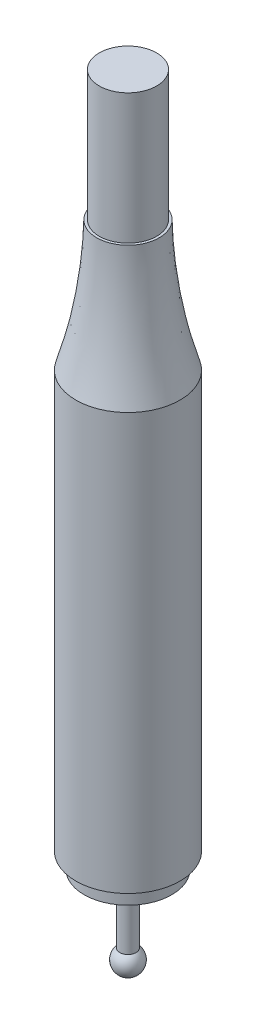
ISO-10303-21;
HEADER;
FILE_DESCRIPTION(('STEP AP214'),'2;1');
FILE_NAME('part.step','',(''),(''),'','','');
FILE_SCHEMA(('AUTOMOTIVE_DESIGN { 1 0 10303 214 1 1 1 1 }'));
ENDSEC;
DATA;
#1=APPLICATION_CONTEXT('core data for automotive mechanical design processes');
#2=APPLICATION_PROTOCOL_DEFINITION('international standard','automotive_design',2000,#1);
#3=PRODUCT_CONTEXT('',#1,'mechanical');
#4=PRODUCT('Part','Part','',(#3));
#5=PRODUCT_RELATED_PRODUCT_CATEGORY('part','',(#4));
#6=PRODUCT_DEFINITION_FORMATION('','',#4);
#7=PRODUCT_DEFINITION_CONTEXT('part definition',#1,'design');
#8=PRODUCT_DEFINITION('design','',#6,#7);
#9=PRODUCT_DEFINITION_SHAPE('','',#8);
#10=(LENGTH_UNIT() NAMED_UNIT(*) SI_UNIT(.MILLI.,.METRE.));
#11=(NAMED_UNIT(*) PLANE_ANGLE_UNIT() SI_UNIT($,.RADIAN.));
#12=(NAMED_UNIT(*) SI_UNIT($,.STERADIAN.) SOLID_ANGLE_UNIT());
#13=UNCERTAINTY_MEASURE_WITH_UNIT(LENGTH_MEASURE(1.E-05),#10,'distance_accuracy_value','');
#14=(GEOMETRIC_REPRESENTATION_CONTEXT(3) GLOBAL_UNCERTAINTY_ASSIGNED_CONTEXT((#13)) GLOBAL_UNIT_ASSIGNED_CONTEXT((#10,
#11,#12)) REPRESENTATION_CONTEXT('',''));
#15=CARTESIAN_POINT('',(0.,0.,0.));
#16=DIRECTION('',(0.,0.,1.));
#17=DIRECTION('',(1.,0.,0.));
#18=AXIS2_PLACEMENT_3D('',#15,#16,#17);
#19=CARTESIAN_POINT('',(0.,165.1,0.));
#20=DIRECTION('',(0.,1.,0.));
#21=DIRECTION('',(0.,0.,1.));
#22=AXIS2_PLACEMENT_3D('',#19,#20,#21);
#23=CYLINDRICAL_SURFACE('',#22,12.7);
#24=CARTESIAN_POINT('',(0.,101.6,0.));
#25=DIRECTION('',(0.,1.,0.));
#26=DIRECTION('',(0.,0.,1.));
#27=AXIS2_PLACEMENT_3D('',#24,#25,#26);
#28=CIRCLE('',#27,12.7);
#29=CARTESIAN_POINT('',(0.,101.6,12.7));
#30=VERTEX_POINT('',#29);
#31=EDGE_CURVE('E10',#30,#30,#28,.T.);
#32=ORIENTED_EDGE('',*,*,#31,.F.);
#33=EDGE_LOOP('',(#32));
#34=FACE_BOUND('',#33,.T.);
#35=CARTESIAN_POINT('',(0.,0.,0.));
#36=DIRECTION('',(0.,1.,0.));
#37=DIRECTION('',(0.,0.,1.));
#38=AXIS2_PLACEMENT_3D('',#35,#36,#37);
#39=CIRCLE('',#38,12.7);
#40=CARTESIAN_POINT('',(0.,0.,12.7));
#41=VERTEX_POINT('',#40);
#42=EDGE_CURVE('E62',#41,#41,#39,.T.);
#43=ORIENTED_EDGE('',*,*,#42,.T.);
#44=EDGE_LOOP('',(#43));
#45=FACE_BOUND('',#44,.T.);
#46=ADVANCED_FACE('F31',(#34,#45),#23,.T.);
#47=CARTESIAN_POINT('',(12.7,101.6,0.));
#48=CARTESIAN_POINT('',(7.96590432763047,117.119921912594,0.));
#49=CARTESIAN_POINT('',(7.62,133.35,0.));
#50=B_SPLINE_CURVE_WITH_KNOTS('',2,(#47,#48,#49),.UNSPECIFIED.,.F.,.F.,(3,3),(0.,1.),.UNSPECIFIED.);
#51=CARTESIAN_POINT('',(0.,165.1,0.));
#52=DIRECTION('',(0.,1.,0.));
#53=AXIS1_PLACEMENT('',#51,#52);
#54=SURFACE_OF_REVOLUTION('',#50,#53);
#55=CARTESIAN_POINT('',(0.,133.35,0.));
#56=DIRECTION('',(0.,1.,0.));
#57=DIRECTION('',(0.,0.,1.));
#58=AXIS2_PLACEMENT_3D('',#55,#56,#57);
#59=CIRCLE('',#58,7.62);
#60=CARTESIAN_POINT('',(0.,133.35,7.62));
#61=VERTEX_POINT('',#60);
#62=EDGE_CURVE('E37',#61,#61,#59,.T.);
#63=ORIENTED_EDGE('',*,*,#62,.F.);
#64=EDGE_LOOP('',(#63));
#65=FACE_BOUND('',#64,.T.);
#66=ORIENTED_EDGE('',*,*,#31,.T.);
#67=EDGE_LOOP('',(#66));
#68=FACE_BOUND('',#67,.T.);
#69=ADVANCED_FACE('F71',(#65,#68),#54,.T.);
#70=CARTESIAN_POINT('',(7.,133.35,0.));
#71=DIRECTION('',(0.,-1.,0.));
#72=DIRECTION('',(0.,0.,-1.));
#73=AXIS2_PLACEMENT_3D('',#70,#71,#72);
#74=PLANE('',#73);
#75=CARTESIAN_POINT('',(0.,133.35,0.));
#76=DIRECTION('',(0.,1.,0.));
#77=DIRECTION('',(0.,0.,1.));
#78=AXIS2_PLACEMENT_3D('',#75,#76,#77);
#79=CIRCLE('',#78,7.);
#80=CARTESIAN_POINT('',(0.,133.35,7.));
#81=VERTEX_POINT('',#80);
#82=EDGE_CURVE('E41',#81,#81,#79,.T.);
#83=ORIENTED_EDGE('',*,*,#82,.F.);
#84=EDGE_LOOP('',(#83));
#85=FACE_BOUND('',#84,.T.);
#86=ORIENTED_EDGE('',*,*,#62,.T.);
#87=EDGE_LOOP('',(#86));
#88=FACE_BOUND('',#87,.T.);
#89=ADVANCED_FACE('F74',(#85,#88),#74,.F.);
#90=CARTESIAN_POINT('',(0.,165.1,0.));
#91=DIRECTION('',(0.,1.,0.));
#92=DIRECTION('',(0.,0.,1.));
#93=AXIS2_PLACEMENT_3D('',#90,#91,#92);
#94=CYLINDRICAL_SURFACE('',#93,7.);
#95=CARTESIAN_POINT('',(0.,165.1,0.));
#96=DIRECTION('',(0.,1.,0.));
#97=DIRECTION('',(0.,0.,1.));
#98=AXIS2_PLACEMENT_3D('',#95,#96,#97);
#99=CIRCLE('',#98,7.);
#100=CARTESIAN_POINT('',(0.,165.1,7.));
#101=VERTEX_POINT('',#100);
#102=EDGE_CURVE('E45',#101,#101,#99,.T.);
#103=ORIENTED_EDGE('',*,*,#102,.F.);
#104=EDGE_LOOP('',(#103));
#105=FACE_BOUND('',#104,.T.);
#106=ORIENTED_EDGE('',*,*,#82,.T.);
#107=EDGE_LOOP('',(#106));
#108=FACE_BOUND('',#107,.T.);
#109=ADVANCED_FACE('F78',(#105,#108),#94,.T.);
#110=CARTESIAN_POINT('',(0.,165.1,0.));
#111=DIRECTION('',(0.,-1.,0.));
#112=DIRECTION('',(0.,0.,-1.));
#113=AXIS2_PLACEMENT_3D('',#110,#111,#112);
#114=PLANE('',#113);
#115=ORIENTED_EDGE('',*,*,#102,.T.);
#116=EDGE_LOOP('',(#115));
#117=FACE_BOUND('',#116,.T.);
#118=ADVANCED_FACE('F82',(#117),#114,.F.);
#119=CARTESIAN_POINT('',(0.,-22.9343928913859,0.));
#120=DIRECTION('',(0.,1.,0.));
#121=DIRECTION('',(-1.,0.,0.));
#122=AXIS2_PLACEMENT_3D('',#119,#120,#121);
#123=SPHERICAL_SURFACE('',#122,3.175);
#124=CARTESIAN_POINT('',(0.,-20.4559093107715,0.));
#125=DIRECTION('',(0.,1.,0.));
#126=DIRECTION('',(0.,0.,1.));
#127=AXIS2_PLACEMENT_3D('',#124,#125,#126);
#128=CIRCLE('',#127,1.98437500000002);
#129=CARTESIAN_POINT('',(0.,-20.4559093107715,1.98437500000002));
#130=VERTEX_POINT('',#129);
#131=EDGE_CURVE('E50',#130,#130,#128,.T.);
#132=ORIENTED_EDGE('',*,*,#131,.F.);
#133=EDGE_LOOP('',(#132));
#134=FACE_BOUND('',#133,.T.);
#135=ADVANCED_FACE('F86',(#134),#123,.T.);
#136=CARTESIAN_POINT('',(0.,165.1,0.));
#137=DIRECTION('',(0.,1.,0.));
#138=DIRECTION('',(0.,0.,1.));
#139=AXIS2_PLACEMENT_3D('',#136,#137,#138);
#140=CYLINDRICAL_SURFACE('',#139,1.98437500000002);
#141=CARTESIAN_POINT('',(0.,-3.88439289138592,0.));
#142=DIRECTION('',(0.,1.,0.));
#143=DIRECTION('',(0.,0.,1.));
#144=AXIS2_PLACEMENT_3D('',#141,#142,#143);
#145=CIRCLE('',#144,1.98437500000002);
#146=CARTESIAN_POINT('',(0.,-3.88439289138592,1.98437500000002));
#147=VERTEX_POINT('',#146);
#148=EDGE_CURVE('E53',#147,#147,#145,.T.);
#149=ORIENTED_EDGE('',*,*,#148,.F.);
#150=EDGE_LOOP('',(#149));
#151=FACE_BOUND('',#150,.T.);
#152=ORIENTED_EDGE('',*,*,#131,.T.);
#153=EDGE_LOOP('',(#152));
#154=FACE_BOUND('',#153,.T.);
#155=ADVANCED_FACE('F90',(#151,#154),#140,.T.);
#156=CARTESIAN_POINT('',(10.7,-3.88439289138591,0.));
#157=DIRECTION('',(0.,1.,0.));
#158=DIRECTION('',(0.,0.,1.));
#159=AXIS2_PLACEMENT_3D('',#156,#157,#158);
#160=PLANE('',#159);
#161=CARTESIAN_POINT('',(0.,-3.8843928913859,0.));
#162=DIRECTION('',(0.,1.,0.));
#163=DIRECTION('',(0.,0.,1.));
#164=AXIS2_PLACEMENT_3D('',#161,#162,#163);
#165=CIRCLE('',#164,10.7);
#166=CARTESIAN_POINT('',(0.,-3.8843928913859,10.7));
#167=VERTEX_POINT('',#166);
#168=EDGE_CURVE('E56',#167,#167,#165,.T.);
#169=ORIENTED_EDGE('',*,*,#168,.F.);
#170=EDGE_LOOP('',(#169));
#171=FACE_BOUND('',#170,.T.);
#172=ORIENTED_EDGE('',*,*,#148,.T.);
#173=EDGE_LOOP('',(#172));
#174=FACE_BOUND('',#173,.T.);
#175=ADVANCED_FACE('F94',(#171,#174),#160,.F.);
#176=CARTESIAN_POINT('',(0.,165.1,0.));
#177=DIRECTION('',(0.,1.,0.));
#178=DIRECTION('',(0.,0.,1.));
#179=AXIS2_PLACEMENT_3D('',#176,#177,#178);
#180=CYLINDRICAL_SURFACE('',#179,10.7);
#181=CARTESIAN_POINT('',(0.,0.,0.));
#182=DIRECTION('',(0.,1.,0.));
#183=DIRECTION('',(0.,0.,1.));
#184=AXIS2_PLACEMENT_3D('',#181,#182,#183);
#185=CIRCLE('',#184,10.7);
#186=CARTESIAN_POINT('',(0.,0.,10.7));
#187=VERTEX_POINT('',#186);
#188=EDGE_CURVE('E59',#187,#187,#185,.T.);
#189=ORIENTED_EDGE('',*,*,#188,.F.);
#190=EDGE_LOOP('',(#189));
#191=FACE_BOUND('',#190,.T.);
#192=ORIENTED_EDGE('',*,*,#168,.T.);
#193=EDGE_LOOP('',(#192));
#194=FACE_BOUND('',#193,.T.);
#195=ADVANCED_FACE('F98',(#191,#194),#180,.T.);
#196=CARTESIAN_POINT('',(12.7,0.,0.));
#197=DIRECTION('',(0.,1.,0.));
#198=DIRECTION('',(0.,0.,1.));
#199=AXIS2_PLACEMENT_3D('',#196,#197,#198);
#200=PLANE('',#199);
#201=ORIENTED_EDGE('',*,*,#42,.F.);
#202=EDGE_LOOP('',(#201));
#203=FACE_BOUND('',#202,.T.);
#204=ORIENTED_EDGE('',*,*,#188,.T.);
#205=EDGE_LOOP('',(#204));
#206=FACE_BOUND('',#205,.T.);
#207=ADVANCED_FACE('F102',(#203,#206),#200,.F.);
#208=CLOSED_SHELL('',(#46,#69,#89,#109,#118,#135,#155,#175,#195,#207));
#209=MANIFOLD_SOLID_BREP('B2',#208);
#210=ADVANCED_BREP_SHAPE_REPRESENTATION('',(#18,#209),#14);
#211=SHAPE_DEFINITION_REPRESENTATION(#9,#210);
ENDSEC;
END-ISO-10303-21;
